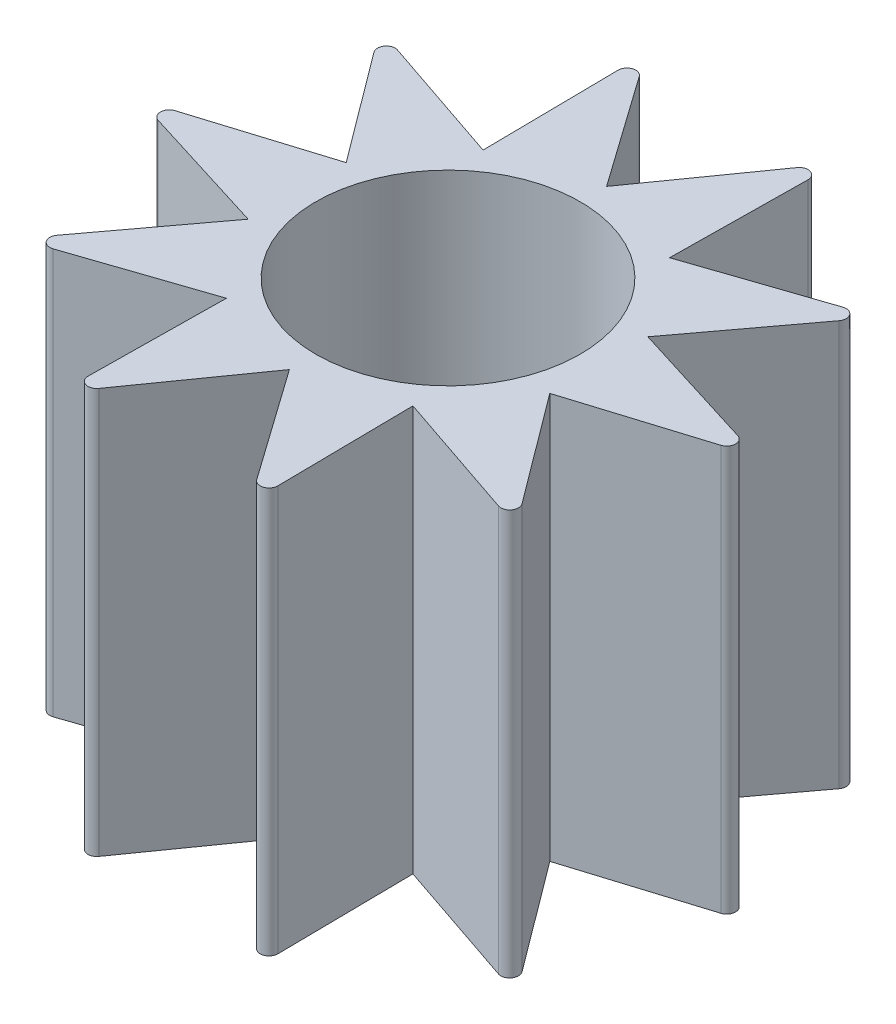
ISO-10303-21;
HEADER;
FILE_DESCRIPTION(('STEP AP214'),'2;1');
FILE_NAME('part.step','',(''),(''),'','','');
FILE_SCHEMA(('AUTOMOTIVE_DESIGN { 1 0 10303 214 1 1 1 1 }'));
ENDSEC;
DATA;
#1=APPLICATION_CONTEXT('core data for automotive mechanical design processes');
#2=APPLICATION_PROTOCOL_DEFINITION('international standard','automotive_design',2000,#1);
#3=PRODUCT_CONTEXT('',#1,'mechanical');
#4=PRODUCT('Part','Part','',(#3));
#5=PRODUCT_RELATED_PRODUCT_CATEGORY('part','',(#4));
#6=PRODUCT_DEFINITION_FORMATION('','',#4);
#7=PRODUCT_DEFINITION_CONTEXT('part definition',#1,'design');
#8=PRODUCT_DEFINITION('design','',#6,#7);
#9=PRODUCT_DEFINITION_SHAPE('','',#8);
#10=(LENGTH_UNIT() NAMED_UNIT(*) SI_UNIT(.MILLI.,.METRE.));
#11=(NAMED_UNIT(*) PLANE_ANGLE_UNIT() SI_UNIT($,.RADIAN.));
#12=(NAMED_UNIT(*) SI_UNIT($,.STERADIAN.) SOLID_ANGLE_UNIT());
#13=UNCERTAINTY_MEASURE_WITH_UNIT(LENGTH_MEASURE(1.E-05),#10,'distance_accuracy_value','');
#14=(GEOMETRIC_REPRESENTATION_CONTEXT(3) GLOBAL_UNCERTAINTY_ASSIGNED_CONTEXT((#13)) GLOBAL_UNIT_ASSIGNED_CONTEXT((#10,
#11,#12)) REPRESENTATION_CONTEXT('',''));
#15=CARTESIAN_POINT('',(0.,0.,0.));
#16=DIRECTION('',(0.,0.,1.));
#17=DIRECTION('',(1.,0.,0.));
#18=AXIS2_PLACEMENT_3D('',#15,#16,#17);
#19=CARTESIAN_POINT('',(0.,0.,0.));
#20=DIRECTION('',(0.,1.,0.));
#21=DIRECTION('',(0.,0.,1.));
#22=AXIS2_PLACEMENT_3D('',#19,#20,#21);
#23=PLANE('',#22);
#24=DIRECTION('',(0.57756630851164,0.,0.816343775178226));
#25=VECTOR('',#24,1.);
#26=CARTESIAN_POINT('',(0.,0.,-0.900000000000001));
#27=LINE('',#26,#25);
#28=CARTESIAN_POINT('',(-0.447945460970009,0.,-1.53313507608251));
#29=VERTEX_POINT('',#28);
#30=CARTESIAN_POINT('',(0.,0.,-0.9));
#31=VERTEX_POINT('',#30);
#32=EDGE_CURVE('E55',#29,#31,#27,.T.);
#33=ORIENTED_EDGE('',*,*,#32,.T.);
#34=DIRECTION('',(0.577566308511659,0.,-0.816343775178213));
#35=VECTOR('',#34,1.);
#36=CARTESIAN_POINT('',(0.447945460970036,0.,-1.53313507608251));
#37=LINE('',#36,#35);
#38=CARTESIAN_POINT('',(0.447945460970035,0.,-1.53313507608251));
#39=VERTEX_POINT('',#38);
#40=EDGE_CURVE('E252',#31,#39,#37,.T.);
#41=ORIENTED_EDGE('',*,*,#40,.T.);
#42=CARTESIAN_POINT('',(0.488762649728943,0.,-1.50425676065692));
#43=DIRECTION('',(0.,1.,0.));
#44=DIRECTION('',(0.,0.,1.));
#45=AXIS2_PLACEMENT_3D('',#42,#43,#44);
#46=CIRCLE('',#45,0.0500000000000028);
#47=CARTESIAN_POINT('',(0.538758697015725,0.,-1.50362806701262));
#48=VERTEX_POINT('',#47);
#49=EDGE_CURVE('E449',#39,#48,#46,.F.);
#50=ORIENTED_EDGE('',*,*,#49,.T.);
#51=DIRECTION('',(-0.0125738728861833,0.,0.999920945735533));
#52=VECTOR('',#51,1.);
#53=CARTESIAN_POINT('',(0.529006727063229,0.,-0.728115294937453));
#54=LINE('',#53,#52);
#55=CARTESIAN_POINT('',(0.529006727063229,0.,-0.728115294937453));
#56=VERTEX_POINT('',#55);
#57=EDGE_CURVE('E447',#48,#56,#54,.T.);
#58=ORIENTED_EDGE('',*,*,#57,.T.);
#59=DIRECTION('',(0.947095790814852,0.,-0.320951029007217));
#60=VECTOR('',#59,1.);
#61=CARTESIAN_POINT('',(1.26354967797147,0.,-0.977036595433534));
#62=LINE('',#61,#60);
#63=CARTESIAN_POINT('',(1.26354967797147,0.,-0.977036595433534));
#64=VERTEX_POINT('',#63);
#65=EDGE_CURVE('E445',#56,#64,#62,.T.);
#66=ORIENTED_EDGE('',*,*,#65,.T.);
#67=CARTESIAN_POINT('',(1.27959722942183,0.,-0.929681805892792));
#68=DIRECTION('',(0.,1.,0.));
#69=DIRECTION('',(0.,0.,1.));
#70=AXIS2_PLACEMENT_3D('',#67,#68,#69);
#71=CIRCLE('',#70,0.0500000000000001);
#72=CARTESIAN_POINT('',(1.31967534447607,0.,-0.899786242782203));
#73=VERTEX_POINT('',#72);
#74=EDGE_CURVE('E443',#64,#73,#71,.F.);
#75=ORIENTED_EDGE('',*,*,#74,.T.);
#76=DIRECTION('',(-0.597911262211717,0.,0.801562301084821));
#77=VECTOR('',#76,1.);
#78=CARTESIAN_POINT('',(0.855950864665639,0.,-0.278115294937449));
#79=LINE('',#78,#77);
#80=CARTESIAN_POINT('',(0.855950864665639,0.,-0.278115294937449));
#81=VERTEX_POINT('',#80);
#82=EDGE_CURVE('E441',#73,#81,#79,.T.);
#83=ORIENTED_EDGE('',*,*,#82,.T.);
#84=DIRECTION('',(0.954866871628731,0.,0.297034101520284));
#85=VECTOR('',#84,1.);
#86=CARTESIAN_POINT('',(1.59652086446179,0.,-0.0477433435814318));
#87=LINE('',#86,#85);
#88=CARTESIAN_POINT('',(1.59652086446179,0.,-0.0477433435814318));
#89=VERTEX_POINT('',#88);
#90=EDGE_CURVE('E439',#81,#89,#87,.T.);
#91=ORIENTED_EDGE('',*,*,#90,.T.);
#92=CARTESIAN_POINT('',(1.58166915938578,0.,0.));
#93=DIRECTION('',(0.,1.,0.));
#94=DIRECTION('',(0.,0.,1.));
#95=AXIS2_PLACEMENT_3D('',#92,#93,#94);
#96=CIRCLE('',#95,0.05);
#97=CARTESIAN_POINT('',(1.59652086446179,0.,0.0477433435814413));
#98=VERTEX_POINT('',#97);
#99=EDGE_CURVE('E437',#89,#98,#96,.F.);
#100=ORIENTED_EDGE('',*,*,#99,.T.);
#101=DIRECTION('',(-0.954866871628732,0.,0.297034101520282));
#102=VECTOR('',#101,1.);
#103=CARTESIAN_POINT('',(0.855950864665637,0.,0.278115294937457));
#104=LINE('',#103,#102);
#105=CARTESIAN_POINT('',(0.855950864665637,0.,0.278115294937457));
#106=VERTEX_POINT('',#105);
#107=EDGE_CURVE('E435',#98,#106,#104,.T.);
#108=ORIENTED_EDGE('',*,*,#107,.T.);
#109=DIRECTION('',(0.597911262211716,0.,0.801562301084822));
#110=VECTOR('',#109,1.);
#111=CARTESIAN_POINT('',(1.31967534447607,0.,0.899786242782211));
#112=LINE('',#111,#110);
#113=CARTESIAN_POINT('',(1.31967534447607,0.,0.899786242782211));
#114=VERTEX_POINT('',#113);
#115=EDGE_CURVE('E433',#106,#114,#112,.T.);
#116=ORIENTED_EDGE('',*,*,#115,.T.);
#117=CARTESIAN_POINT('',(1.27959722942183,0.,0.929681805892799));
#118=DIRECTION('',(0.,1.,0.));
#119=DIRECTION('',(0.,0.,1.));
#120=AXIS2_PLACEMENT_3D('',#117,#118,#119);
#121=CIRCLE('',#120,0.0499999999999999);
#122=CARTESIAN_POINT('',(1.26354967797147,0.,0.977036595433539));
#123=VERTEX_POINT('',#122);
#124=EDGE_CURVE('E431',#114,#123,#121,.F.);
#125=ORIENTED_EDGE('',*,*,#124,.T.);
#126=DIRECTION('',(-0.947095790814852,0.,-0.320951029007218));
#127=VECTOR('',#126,1.);
#128=CARTESIAN_POINT('',(0.529006727063221,0.,0.728115294937457));
#129=LINE('',#128,#127);
#130=CARTESIAN_POINT('',(0.529006727063221,0.,0.728115294937457));
#131=VERTEX_POINT('',#130);
#132=EDGE_CURVE('E429',#123,#131,#129,.T.);
#133=ORIENTED_EDGE('',*,*,#132,.T.);
#134=DIRECTION('',(0.0125738728861741,0.,0.999920945735534));
#135=VECTOR('',#134,1.);
#136=CARTESIAN_POINT('',(0.538758697015713,0.,1.50362806701261));
#137=LINE('',#136,#135);
#138=CARTESIAN_POINT('',(0.538758697015713,0.,1.50362806701261));
#139=VERTEX_POINT('',#138);
#140=EDGE_CURVE('E427',#131,#139,#137,.T.);
#141=ORIENTED_EDGE('',*,*,#140,.T.);
#142=CARTESIAN_POINT('',(0.488762649728936,0.,1.50425676065692));
#143=DIRECTION('',(0.,1.,0.));
#144=DIRECTION('',(0.,0.,1.));
#145=AXIS2_PLACEMENT_3D('',#142,#143,#144);
#146=CIRCLE('',#145,0.05);
#147=CARTESIAN_POINT('',(0.447945460970024,0.,1.53313507608251));
#148=VERTEX_POINT('',#147);
#149=EDGE_CURVE('E425',#139,#148,#146,.F.);
#150=ORIENTED_EDGE('',*,*,#149,.T.);
#151=DIRECTION('',(-0.577566308511657,0.,-0.816343775178214));
#152=VECTOR('',#151,1.);
#153=CARTESIAN_POINT('',(0.,0.,0.900000000000001));
#154=LINE('',#153,#152);
#155=CARTESIAN_POINT('',(0.,0.,0.900000000000001));
#156=VERTEX_POINT('',#155);
#157=EDGE_CURVE('E423',#148,#156,#154,.T.);
#158=ORIENTED_EDGE('',*,*,#157,.T.);
#159=DIRECTION('',(-0.577566308511664,0.,0.816343775178209));
#160=VECTOR('',#159,1.);
#161=CARTESIAN_POINT('',(-0.44794546097004,0.,1.5331350760825));
#162=LINE('',#161,#160);
#163=CARTESIAN_POINT('',(-0.44794546097004,0.,1.5331350760825));
#164=VERTEX_POINT('',#163);
#165=EDGE_CURVE('E421',#156,#164,#162,.T.);
#166=ORIENTED_EDGE('',*,*,#165,.T.);
#167=CARTESIAN_POINT('',(-0.488762649728951,0.,1.50425676065692));
#168=DIRECTION('',(0.,1.,0.));
#169=DIRECTION('',(0.,0.,1.));
#170=AXIS2_PLACEMENT_3D('',#167,#168,#169);
#171=CIRCLE('',#170,0.0500000000000001);
#172=CARTESIAN_POINT('',(-0.538758697015727,0.,1.50362806701261));
#173=VERTEX_POINT('',#172);
#174=EDGE_CURVE('E419',#164,#173,#171,.F.);
#175=ORIENTED_EDGE('',*,*,#174,.T.);
#176=DIRECTION('',(0.0125738728861831,0.,-0.999920945735533));
#177=VECTOR('',#176,1.);
#178=CARTESIAN_POINT('',(-0.529006727063231,0.,0.728115294937449));
#179=LINE('',#178,#177);
#180=CARTESIAN_POINT('',(-0.529006727063231,0.,0.728115294937449));
#181=VERTEX_POINT('',#180);
#182=EDGE_CURVE('E417',#173,#181,#179,.T.);
#183=ORIENTED_EDGE('',*,*,#182,.T.);
#184=DIRECTION('',(-0.947095790814855,0.,0.320951029007209));
#185=VECTOR('',#184,1.);
#186=CARTESIAN_POINT('',(-1.26354967797147,0.,0.977036595433524));
#187=LINE('',#186,#185);
#188=CARTESIAN_POINT('',(-1.26354967797147,0.,0.977036595433524));
#189=VERTEX_POINT('',#188);
#190=EDGE_CURVE('E415',#181,#189,#187,.T.);
#191=ORIENTED_EDGE('',*,*,#190,.T.);
#192=CARTESIAN_POINT('',(-1.27959722942184,0.,0.929681805892782));
#193=DIRECTION('',(0.,1.,0.));
#194=DIRECTION('',(0.,0.,1.));
#195=AXIS2_PLACEMENT_3D('',#192,#193,#194);
#196=CIRCLE('',#195,0.05);
#197=CARTESIAN_POINT('',(-1.31967534447608,0.,0.899786242782196));
#198=VERTEX_POINT('',#197);
#199=EDGE_CURVE('E413',#189,#198,#196,.F.);
#200=ORIENTED_EDGE('',*,*,#199,.T.);
#201=DIRECTION('',(0.597911262211723,0.,-0.801562301084816));
#202=VECTOR('',#201,1.);
#203=CARTESIAN_POINT('',(-0.855950864665641,0.,0.278115294937444));
#204=LINE('',#203,#202);
#205=CARTESIAN_POINT('',(-0.855950864665641,0.,0.278115294937444));
#206=VERTEX_POINT('',#205);
#207=EDGE_CURVE('E411',#198,#206,#204,.T.);
#208=ORIENTED_EDGE('',*,*,#207,.T.);
#209=DIRECTION('',(-0.954866871628729,0.,-0.297034101520289));
#210=VECTOR('',#209,1.);
#211=CARTESIAN_POINT('',(-1.59652086446179,0.,0.0477433435814231));
#212=LINE('',#211,#210);
#213=CARTESIAN_POINT('',(-1.59652086446179,0.,0.0477433435814231));
#214=VERTEX_POINT('',#213);
#215=EDGE_CURVE('E409',#206,#214,#212,.T.);
#216=ORIENTED_EDGE('',*,*,#215,.T.);
#217=CARTESIAN_POINT('',(-1.58166915938577,0.,0.));
#218=DIRECTION('',(0.,1.,0.));
#219=DIRECTION('',(0.,0.,1.));
#220=AXIS2_PLACEMENT_3D('',#217,#218,#219);
#221=CIRCLE('',#220,0.05);
#222=CARTESIAN_POINT('',(-1.59652086446179,0.,-0.0477433435814509));
#223=VERTEX_POINT('',#222);
#224=EDGE_CURVE('E407',#214,#223,#221,.F.);
#225=ORIENTED_EDGE('',*,*,#224,.T.);
#226=DIRECTION('',(0.954866871628733,0.,-0.297034101520276));
#227=VECTOR('',#226,1.);
#228=CARTESIAN_POINT('',(-0.855950864665634,0.,-0.278115294937461));
#229=LINE('',#228,#227);
#230=CARTESIAN_POINT('',(-0.855950864665635,0.,-0.278115294937461));
#231=VERTEX_POINT('',#230);
#232=EDGE_CURVE('E405',#223,#231,#229,.T.);
#233=ORIENTED_EDGE('',*,*,#232,.T.);
#234=DIRECTION('',(-0.59791126221171,0.,-0.801562301084826));
#235=VECTOR('',#234,1.);
#236=CARTESIAN_POINT('',(-1.31967534447606,0.,-0.899786242782219));
#237=LINE('',#236,#235);
#238=CARTESIAN_POINT('',(-1.31967534447606,0.,-0.899786242782219));
#239=VERTEX_POINT('',#238);
#240=EDGE_CURVE('E403',#231,#239,#237,.T.);
#241=ORIENTED_EDGE('',*,*,#240,.T.);
#242=CARTESIAN_POINT('',(-1.27959722942182,0.,-0.929681805892806));
#243=DIRECTION('',(0.,1.,0.));
#244=DIRECTION('',(0.,0.,1.));
#245=AXIS2_PLACEMENT_3D('',#242,#243,#244);
#246=CIRCLE('',#245,0.0500000000000001);
#247=CARTESIAN_POINT('',(-1.26354967797145,0.,-0.977036595433549));
#248=VERTEX_POINT('',#247);
#249=EDGE_CURVE('E401',#239,#248,#246,.F.);
#250=ORIENTED_EDGE('',*,*,#249,.T.);
#251=DIRECTION('',(0.947095790814849,0.,0.320951029007225));
#252=VECTOR('',#251,1.);
#253=CARTESIAN_POINT('',(-0.529006727063215,0.,-0.72811529493746));
#254=LINE('',#253,#252);
#255=CARTESIAN_POINT('',(-0.529006727063215,0.,-0.72811529493746));
#256=VERTEX_POINT('',#255);
#257=EDGE_CURVE('E397',#248,#256,#254,.T.);
#258=ORIENTED_EDGE('',*,*,#257,.T.);
#259=DIRECTION('',(-0.0125738728861667,0.,-0.999920945735533));
#260=VECTOR('',#259,1.);
#261=CARTESIAN_POINT('',(-0.538758697015699,0.,-1.50362806701262));
#262=LINE('',#261,#260);
#263=CARTESIAN_POINT('',(-0.538758697015699,0.,-1.50362806701262));
#264=VERTEX_POINT('',#263);
#265=EDGE_CURVE('E395',#256,#264,#262,.T.);
#266=ORIENTED_EDGE('',*,*,#265,.T.);
#267=CARTESIAN_POINT('',(-0.48876264972892,0.,-1.50425676065693));
#268=DIRECTION('',(0.,1.,0.));
#269=DIRECTION('',(0.,0.,1.));
#270=AXIS2_PLACEMENT_3D('',#267,#268,#269);
#271=CIRCLE('',#270,0.05);
#272=EDGE_CURVE('E392',#264,#29,#271,.F.);
#273=ORIENTED_EDGE('',*,*,#272,.T.);
#274=EDGE_LOOP('',(#33,#41,#50,#58,#66,#75,#83,#91,#100,#108,#116,#125,#133,#141,#150,#158,#166,
#175,#183,#191,#200,#208,#216,#225,#233,#241,#250,#258,#266,#273));
#275=FACE_BOUND('',#274,.T.);
#276=CARTESIAN_POINT('',(0.,0.,0.));
#277=DIRECTION('',(0.,1.,0.));
#278=DIRECTION('',(0.,0.,1.));
#279=AXIS2_PLACEMENT_3D('',#276,#277,#278);
#280=CIRCLE('',#279,0.75);
#281=CARTESIAN_POINT('',(0.,0.,0.750000000000001));
#282=VERTEX_POINT('',#281);
#283=EDGE_CURVE('E390',#282,#282,#280,.F.);
#284=ORIENTED_EDGE('',*,*,#283,.F.);
#285=EDGE_LOOP('',(#284));
#286=FACE_BOUND('',#285,.T.);
#287=ADVANCED_FACE('F33',(#275,#286),#23,.F.);
#288=CARTESIAN_POINT('',(0.,-0.001000000000001,0.));
#289=DIRECTION('',(0.,1.,0.));
#290=DIRECTION('',(0.,0.,1.));
#291=AXIS2_PLACEMENT_3D('',#288,#289,#290);
#292=CYLINDRICAL_SURFACE('',#291,0.75);
#293=CARTESIAN_POINT('',(0.,2.3,0.));
#294=DIRECTION('',(0.,1.,0.));
#295=DIRECTION('',(0.,0.,1.));
#296=AXIS2_PLACEMENT_3D('',#293,#294,#295);
#297=CIRCLE('',#296,0.75);
#298=CARTESIAN_POINT('',(0.,2.3,0.750000000000001));
#299=VERTEX_POINT('',#298);
#300=EDGE_CURVE('E11',#299,#299,#297,.T.);
#301=ORIENTED_EDGE('',*,*,#300,.T.);
#302=EDGE_LOOP('',(#301));
#303=FACE_BOUND('',#302,.T.);
#304=ORIENTED_EDGE('',*,*,#283,.T.);
#305=EDGE_LOOP('',(#304));
#306=FACE_BOUND('',#305,.T.);
#307=ADVANCED_FACE('F595',(#303,#306),#292,.F.);
#308=CARTESIAN_POINT('',(0.,-0.001000000000001,-0.900000000000001));
#309=DIRECTION('',(0.816343775178226,0.,-0.57756630851164));
#310=DIRECTION('',(-0.57756630851164,0.,-0.816343775178226));
#311=AXIS2_PLACEMENT_3D('',#308,#309,#310);
#312=PLANE('',#311);
#313=ORIENTED_EDGE('',*,*,#32,.F.);
#314=DIRECTION('',(0.,1.,0.));
#315=VECTOR('',#314,1.);
#316=CARTESIAN_POINT('',(-0.447945460970009,-0.001000000000001,-1.53313507608251));
#317=LINE('',#316,#315);
#318=CARTESIAN_POINT('',(-0.447945460970009,2.3,-1.53313507608251));
#319=VERTEX_POINT('',#318);
#320=EDGE_CURVE('E230',#29,#319,#317,.T.);
#321=ORIENTED_EDGE('',*,*,#320,.T.);
#322=DIRECTION('',(-0.57756630851164,0.,-0.816343775178226));
#323=VECTOR('',#322,1.);
#324=CARTESIAN_POINT('',(0.,2.3,-0.900000000000001));
#325=LINE('',#324,#323);
#326=CARTESIAN_POINT('',(0.,2.3,-0.900000000000001));
#327=VERTEX_POINT('',#326);
#328=EDGE_CURVE('E235',#327,#319,#325,.T.);
#329=ORIENTED_EDGE('',*,*,#328,.F.);
#330=DIRECTION('',(0.,1.,0.));
#331=VECTOR('',#330,1.);
#332=CARTESIAN_POINT('',(0.,-0.001000000000001,-0.900000000000001));
#333=LINE('',#332,#331);
#334=EDGE_CURVE('E40',#31,#327,#333,.T.);
#335=ORIENTED_EDGE('',*,*,#334,.F.);
#336=EDGE_LOOP('',(#313,#321,#329,#335));
#337=FACE_BOUND('',#336,.T.);
#338=ADVANCED_FACE('F232',(#337),#312,.T.);
#339=CARTESIAN_POINT('',(0.447945460970036,-0.001000000000001,-1.53313507608251));
#340=DIRECTION('',(-0.816343775178213,0.,-0.577566308511659));
#341=DIRECTION('',(-0.577566308511659,0.,0.816343775178213));
#342=AXIS2_PLACEMENT_3D('',#339,#340,#341);
#343=PLANE('',#342);
#344=ORIENTED_EDGE('',*,*,#40,.F.);
#345=ORIENTED_EDGE('',*,*,#334,.T.);
#346=DIRECTION('',(-0.577566308511659,0.,0.816343775178213));
#347=VECTOR('',#346,1.);
#348=CARTESIAN_POINT('',(0.447945460970036,2.3,-1.53313507608251));
#349=LINE('',#348,#347);
#350=CARTESIAN_POINT('',(0.447945460970036,2.3,-1.53313507608251));
#351=VERTEX_POINT('',#350);
#352=EDGE_CURVE('E240',#351,#327,#349,.T.);
#353=ORIENTED_EDGE('',*,*,#352,.F.);
#354=DIRECTION('',(0.,1.,0.));
#355=VECTOR('',#354,1.);
#356=CARTESIAN_POINT('',(0.447945460970036,-0.001000000000001,-1.53313507608251));
#357=LINE('',#356,#355);
#358=EDGE_CURVE('E336',#39,#351,#357,.T.);
#359=ORIENTED_EDGE('',*,*,#358,.F.);
#360=EDGE_LOOP('',(#344,#345,#353,#359));
#361=FACE_BOUND('',#360,.T.);
#362=ADVANCED_FACE('F459',(#361),#343,.T.);
#363=CARTESIAN_POINT('',(0.488762649728943,-0.001000000000001,-1.50425676065692));
#364=DIRECTION('',(0.,1.,0.));
#365=DIRECTION('',(0.,0.,1.));
#366=AXIS2_PLACEMENT_3D('',#363,#364,#365);
#367=CYLINDRICAL_SURFACE('',#366,0.0500000000000028);
#368=ORIENTED_EDGE('',*,*,#49,.F.);
#369=ORIENTED_EDGE('',*,*,#358,.T.);
#370=CARTESIAN_POINT('',(0.488762649728943,2.3,-1.50425676065692));
#371=DIRECTION('',(0.,1.,0.));
#372=DIRECTION('',(0.,0.,1.));
#373=AXIS2_PLACEMENT_3D('',#370,#371,#372);
#374=CIRCLE('',#373,0.0500000000000028);
#375=CARTESIAN_POINT('',(0.538758697015723,2.3,-1.50362806701262));
#376=VERTEX_POINT('',#375);
#377=EDGE_CURVE('E332',#376,#351,#374,.T.);
#378=ORIENTED_EDGE('',*,*,#377,.F.);
#379=DIRECTION('',(0.,1.,0.));
#380=VECTOR('',#379,1.);
#381=CARTESIAN_POINT('',(0.538758697015723,-0.001000000000001,-1.50362806701262));
#382=LINE('',#381,#380);
#383=EDGE_CURVE('E338',#48,#376,#382,.T.);
#384=ORIENTED_EDGE('',*,*,#383,.F.);
#385=EDGE_LOOP('',(#368,#369,#378,#384));
#386=FACE_BOUND('',#385,.T.);
#387=ADVANCED_FACE('F457',(#386),#367,.T.);
#388=CARTESIAN_POINT('',(0.529006727063229,-0.001000000000001,-0.728115294937453));
#389=DIRECTION('',(0.999920945735533,0.,0.0125738728861833));
#390=DIRECTION('',(0.0125738728861833,0.,-0.999920945735533));
#391=AXIS2_PLACEMENT_3D('',#388,#389,#390);
#392=PLANE('',#391);
#393=ORIENTED_EDGE('',*,*,#57,.F.);
#394=ORIENTED_EDGE('',*,*,#383,.T.);
#395=DIRECTION('',(0.0125738728861833,0.,-0.999920945735533));
#396=VECTOR('',#395,1.);
#397=CARTESIAN_POINT('',(0.529006727063229,2.3,-0.728115294937453));
#398=LINE('',#397,#396);
#399=CARTESIAN_POINT('',(0.529006727063229,2.3,-0.728115294937453));
#400=VERTEX_POINT('',#399);
#401=EDGE_CURVE('E329',#400,#376,#398,.T.);
#402=ORIENTED_EDGE('',*,*,#401,.F.);
#403=DIRECTION('',(0.,1.,0.));
#404=VECTOR('',#403,1.);
#405=CARTESIAN_POINT('',(0.529006727063229,-0.001000000000001,-0.728115294937453));
#406=LINE('',#405,#404);
#407=EDGE_CURVE('E340',#56,#400,#406,.T.);
#408=ORIENTED_EDGE('',*,*,#407,.F.);
#409=EDGE_LOOP('',(#393,#394,#402,#408));
#410=FACE_BOUND('',#409,.T.);
#411=ADVANCED_FACE('F464',(#410),#392,.T.);
#412=CARTESIAN_POINT('',(1.26354967797147,-0.001000000000001,-0.977036595433534));
#413=DIRECTION('',(-0.320951029007217,0.,-0.947095790814852));
#414=DIRECTION('',(-0.947095790814852,0.,0.320951029007217));
#415=AXIS2_PLACEMENT_3D('',#412,#413,#414);
#416=PLANE('',#415);
#417=ORIENTED_EDGE('',*,*,#65,.F.);
#418=ORIENTED_EDGE('',*,*,#407,.T.);
#419=DIRECTION('',(-0.947095790814852,0.,0.320951029007217));
#420=VECTOR('',#419,1.);
#421=CARTESIAN_POINT('',(1.26354967797147,2.3,-0.977036595433534));
#422=LINE('',#421,#420);
#423=CARTESIAN_POINT('',(1.26354967797147,2.3,-0.977036595433534));
#424=VERTEX_POINT('',#423);
#425=EDGE_CURVE('E326',#424,#400,#422,.T.);
#426=ORIENTED_EDGE('',*,*,#425,.F.);
#427=DIRECTION('',(0.,1.,0.));
#428=VECTOR('',#427,1.);
#429=CARTESIAN_POINT('',(1.26354967797147,-0.001000000000001,-0.977036595433534));
#430=LINE('',#429,#428);
#431=EDGE_CURVE('E342',#64,#424,#430,.T.);
#432=ORIENTED_EDGE('',*,*,#431,.F.);
#433=EDGE_LOOP('',(#417,#418,#426,#432));
#434=FACE_BOUND('',#433,.T.);
#435=ADVANCED_FACE('F469',(#434),#416,.T.);
#436=CARTESIAN_POINT('',(1.27959722942183,-0.001000000000001,-0.929681805892792));
#437=DIRECTION('',(0.,1.,0.));
#438=DIRECTION('',(0.,0.,1.));
#439=AXIS2_PLACEMENT_3D('',#436,#437,#438);
#440=CYLINDRICAL_SURFACE('',#439,0.0500000000000001);
#441=ORIENTED_EDGE('',*,*,#74,.F.);
#442=ORIENTED_EDGE('',*,*,#431,.T.);
#443=CARTESIAN_POINT('',(1.27959722942183,2.3,-0.929681805892792));
#444=DIRECTION('',(0.,1.,0.));
#445=DIRECTION('',(0.,0.,1.));
#446=AXIS2_PLACEMENT_3D('',#443,#444,#445);
#447=CIRCLE('',#446,0.0500000000000001);
#448=CARTESIAN_POINT('',(1.31967534447607,2.3,-0.899786242782203));
#449=VERTEX_POINT('',#448);
#450=EDGE_CURVE('E323',#449,#424,#447,.T.);
#451=ORIENTED_EDGE('',*,*,#450,.F.);
#452=DIRECTION('',(0.,1.,0.));
#453=VECTOR('',#452,1.);
#454=CARTESIAN_POINT('',(1.31967534447607,-0.001000000000001,-0.899786242782203));
#455=LINE('',#454,#453);
#456=EDGE_CURVE('E344',#73,#449,#455,.T.);
#457=ORIENTED_EDGE('',*,*,#456,.F.);
#458=EDGE_LOOP('',(#441,#442,#451,#457));
#459=FACE_BOUND('',#458,.T.);
#460=ADVANCED_FACE('F472',(#459),#440,.T.);
#461=CARTESIAN_POINT('',(0.855950864665639,-0.001000000000001,-0.278115294937449));
#462=DIRECTION('',(0.801562301084821,0.,0.597911262211717));
#463=DIRECTION('',(0.597911262211717,0.,-0.801562301084821));
#464=AXIS2_PLACEMENT_3D('',#461,#462,#463);
#465=PLANE('',#464);
#466=ORIENTED_EDGE('',*,*,#82,.F.);
#467=ORIENTED_EDGE('',*,*,#456,.T.);
#468=DIRECTION('',(0.597911262211717,0.,-0.801562301084821));
#469=VECTOR('',#468,1.);
#470=CARTESIAN_POINT('',(0.855950864665639,2.3,-0.278115294937449));
#471=LINE('',#470,#469);
#472=CARTESIAN_POINT('',(0.855950864665639,2.3,-0.278115294937449));
#473=VERTEX_POINT('',#472);
#474=EDGE_CURVE('E320',#473,#449,#471,.T.);
#475=ORIENTED_EDGE('',*,*,#474,.F.);
#476=DIRECTION('',(0.,1.,0.));
#477=VECTOR('',#476,1.);
#478=CARTESIAN_POINT('',(0.855950864665639,-0.001000000000001,-0.278115294937449));
#479=LINE('',#478,#477);
#480=EDGE_CURVE('E346',#81,#473,#479,.T.);
#481=ORIENTED_EDGE('',*,*,#480,.F.);
#482=EDGE_LOOP('',(#466,#467,#475,#481));
#483=FACE_BOUND('',#482,.T.);
#484=ADVANCED_FACE('F478',(#483),#465,.T.);
#485=CARTESIAN_POINT('',(1.59652086446179,-0.001000000000001,-0.0477433435814318));
#486=DIRECTION('',(0.297034101520284,0.,-0.954866871628731));
#487=DIRECTION('',(-0.954866871628731,0.,-0.297034101520284));
#488=AXIS2_PLACEMENT_3D('',#485,#486,#487);
#489=PLANE('',#488);
#490=ORIENTED_EDGE('',*,*,#90,.F.);
#491=ORIENTED_EDGE('',*,*,#480,.T.);
#492=DIRECTION('',(-0.954866871628731,0.,-0.297034101520284));
#493=VECTOR('',#492,1.);
#494=CARTESIAN_POINT('',(1.59652086446179,2.3,-0.0477433435814318));
#495=LINE('',#494,#493);
#496=CARTESIAN_POINT('',(1.59652086446179,2.3,-0.0477433435814318));
#497=VERTEX_POINT('',#496);
#498=EDGE_CURVE('E317',#497,#473,#495,.T.);
#499=ORIENTED_EDGE('',*,*,#498,.F.);
#500=DIRECTION('',(0.,1.,0.));
#501=VECTOR('',#500,1.);
#502=CARTESIAN_POINT('',(1.59652086446179,-0.001000000000001,-0.0477433435814318));
#503=LINE('',#502,#501);
#504=EDGE_CURVE('E348',#89,#497,#503,.T.);
#505=ORIENTED_EDGE('',*,*,#504,.F.);
#506=EDGE_LOOP('',(#490,#491,#499,#505));
#507=FACE_BOUND('',#506,.T.);
#508=ADVANCED_FACE('F482',(#507),#489,.T.);
#509=CARTESIAN_POINT('',(1.58166915938578,-0.001000000000001,0.));
#510=DIRECTION('',(0.,1.,0.));
#511=DIRECTION('',(0.,0.,1.));
#512=AXIS2_PLACEMENT_3D('',#509,#510,#511);
#513=CYLINDRICAL_SURFACE('',#512,0.05);
#514=ORIENTED_EDGE('',*,*,#99,.F.);
#515=ORIENTED_EDGE('',*,*,#504,.T.);
#516=CARTESIAN_POINT('',(1.58166915938578,2.3,0.));
#517=DIRECTION('',(0.,1.,0.));
#518=DIRECTION('',(0.,0.,1.));
#519=AXIS2_PLACEMENT_3D('',#516,#517,#518);
#520=CIRCLE('',#519,0.05);
#521=CARTESIAN_POINT('',(1.59652086446179,2.3,0.0477433435814413));
#522=VERTEX_POINT('',#521);
#523=EDGE_CURVE('E314',#522,#497,#520,.T.);
#524=ORIENTED_EDGE('',*,*,#523,.F.);
#525=DIRECTION('',(0.,1.,0.));
#526=VECTOR('',#525,1.);
#527=CARTESIAN_POINT('',(1.59652086446179,-0.001000000000001,0.0477433435814413));
#528=LINE('',#527,#526);
#529=EDGE_CURVE('E350',#98,#522,#528,.T.);
#530=ORIENTED_EDGE('',*,*,#529,.F.);
#531=EDGE_LOOP('',(#514,#515,#524,#530));
#532=FACE_BOUND('',#531,.T.);
#533=ADVANCED_FACE('F488',(#532),#513,.T.);
#534=CARTESIAN_POINT('',(0.855950864665637,-0.001000000000001,0.278115294937457));
#535=DIRECTION('',(0.297034101520282,0.,0.954866871628731));
#536=DIRECTION('',(0.954866871628732,0.,-0.297034101520282));
#537=AXIS2_PLACEMENT_3D('',#534,#535,#536);
#538=PLANE('',#537);
#539=ORIENTED_EDGE('',*,*,#107,.F.);
#540=ORIENTED_EDGE('',*,*,#529,.T.);
#541=DIRECTION('',(0.954866871628731,0.,-0.297034101520282));
#542=VECTOR('',#541,1.);
#543=CARTESIAN_POINT('',(0.855950864665637,2.3,0.278115294937457));
#544=LINE('',#543,#542);
#545=CARTESIAN_POINT('',(0.855950864665637,2.3,0.278115294937457));
#546=VERTEX_POINT('',#545);
#547=EDGE_CURVE('E311',#546,#522,#544,.T.);
#548=ORIENTED_EDGE('',*,*,#547,.F.);
#549=DIRECTION('',(0.,1.,0.));
#550=VECTOR('',#549,1.);
#551=CARTESIAN_POINT('',(0.855950864665637,-0.001000000000001,0.278115294937457));
#552=LINE('',#551,#550);
#553=EDGE_CURVE('E352',#106,#546,#552,.T.);
#554=ORIENTED_EDGE('',*,*,#553,.F.);
#555=EDGE_LOOP('',(#539,#540,#548,#554));
#556=FACE_BOUND('',#555,.T.);
#557=ADVANCED_FACE('F492',(#556),#538,.T.);
#558=CARTESIAN_POINT('',(1.31967534447607,-0.001000000000001,0.899786242782211));
#559=DIRECTION('',(0.801562301084822,0.,-0.597911262211716));
#560=DIRECTION('',(-0.597911262211716,0.,-0.801562301084822));
#561=AXIS2_PLACEMENT_3D('',#558,#559,#560);
#562=PLANE('',#561);
#563=ORIENTED_EDGE('',*,*,#115,.F.);
#564=ORIENTED_EDGE('',*,*,#553,.T.);
#565=DIRECTION('',(-0.597911262211716,0.,-0.801562301084822));
#566=VECTOR('',#565,1.);
#567=CARTESIAN_POINT('',(1.31967534447607,2.3,0.899786242782211));
#568=LINE('',#567,#566);
#569=CARTESIAN_POINT('',(1.31967534447607,2.3,0.899786242782211));
#570=VERTEX_POINT('',#569);
#571=EDGE_CURVE('E308',#570,#546,#568,.T.);
#572=ORIENTED_EDGE('',*,*,#571,.F.);
#573=DIRECTION('',(0.,1.,0.));
#574=VECTOR('',#573,1.);
#575=CARTESIAN_POINT('',(1.31967534447607,-0.001000000000001,0.899786242782211));
#576=LINE('',#575,#574);
#577=EDGE_CURVE('E354',#114,#570,#576,.T.);
#578=ORIENTED_EDGE('',*,*,#577,.F.);
#579=EDGE_LOOP('',(#563,#564,#572,#578));
#580=FACE_BOUND('',#579,.T.);
#581=ADVANCED_FACE('F498',(#580),#562,.T.);
#582=CARTESIAN_POINT('',(1.27959722942183,-0.001000000000001,0.929681805892799));
#583=DIRECTION('',(0.,1.,0.));
#584=DIRECTION('',(0.,0.,1.));
#585=AXIS2_PLACEMENT_3D('',#582,#583,#584);
#586=CYLINDRICAL_SURFACE('',#585,0.0499999999999999);
#587=ORIENTED_EDGE('',*,*,#124,.F.);
#588=ORIENTED_EDGE('',*,*,#577,.T.);
#589=CARTESIAN_POINT('',(1.27959722942183,2.3,0.929681805892799));
#590=DIRECTION('',(0.,1.,0.));
#591=DIRECTION('',(0.,0.,1.));
#592=AXIS2_PLACEMENT_3D('',#589,#590,#591);
#593=CIRCLE('',#592,0.0499999999999999);
#594=CARTESIAN_POINT('',(1.26354967797147,2.3,0.977036595433539));
#595=VERTEX_POINT('',#594);
#596=EDGE_CURVE('E305',#595,#570,#593,.T.);
#597=ORIENTED_EDGE('',*,*,#596,.F.);
#598=DIRECTION('',(0.,1.,0.));
#599=VECTOR('',#598,1.);
#600=CARTESIAN_POINT('',(1.26354967797147,-0.001000000000001,0.977036595433539));
#601=LINE('',#600,#599);
#602=EDGE_CURVE('E356',#123,#595,#601,.T.);
#603=ORIENTED_EDGE('',*,*,#602,.F.);
#604=EDGE_LOOP('',(#587,#588,#597,#603));
#605=FACE_BOUND('',#604,.T.);
#606=ADVANCED_FACE('F502',(#605),#586,.T.);
#607=CARTESIAN_POINT('',(0.529006727063221,-0.001000000000001,0.728115294937457));
#608=DIRECTION('',(-0.320951029007218,0.,0.947095790814852));
#609=DIRECTION('',(0.947095790814852,0.,0.320951029007218));
#610=AXIS2_PLACEMENT_3D('',#607,#608,#609);
#611=PLANE('',#610);
#612=ORIENTED_EDGE('',*,*,#132,.F.);
#613=ORIENTED_EDGE('',*,*,#602,.T.);
#614=DIRECTION('',(0.947095790814852,0.,0.320951029007218));
#615=VECTOR('',#614,1.);
#616=CARTESIAN_POINT('',(0.529006727063221,2.3,0.728115294937457));
#617=LINE('',#616,#615);
#618=CARTESIAN_POINT('',(0.529006727063221,2.3,0.728115294937457));
#619=VERTEX_POINT('',#618);
#620=EDGE_CURVE('E302',#619,#595,#617,.T.);
#621=ORIENTED_EDGE('',*,*,#620,.F.);
#622=DIRECTION('',(0.,1.,0.));
#623=VECTOR('',#622,1.);
#624=CARTESIAN_POINT('',(0.529006727063221,-0.001000000000001,0.728115294937457));
#625=LINE('',#624,#623);
#626=EDGE_CURVE('E358',#131,#619,#625,.T.);
#627=ORIENTED_EDGE('',*,*,#626,.F.);
#628=EDGE_LOOP('',(#612,#613,#621,#627));
#629=FACE_BOUND('',#628,.T.);
#630=ADVANCED_FACE('F508',(#629),#611,.T.);
#631=CARTESIAN_POINT('',(0.538758697015713,-0.001000000000001,1.50362806701261));
#632=DIRECTION('',(0.999920945735533,0.,-0.0125738728861741));
#633=DIRECTION('',(-0.0125738728861741,0.,-0.999920945735534));
#634=AXIS2_PLACEMENT_3D('',#631,#632,#633);
#635=PLANE('',#634);
#636=ORIENTED_EDGE('',*,*,#140,.F.);
#637=ORIENTED_EDGE('',*,*,#626,.T.);
#638=DIRECTION('',(-0.0125738728861741,0.,-0.999920945735533));
#639=VECTOR('',#638,1.);
#640=CARTESIAN_POINT('',(0.538758697015713,2.3,1.50362806701261));
#641=LINE('',#640,#639);
#642=CARTESIAN_POINT('',(0.538758697015713,2.3,1.50362806701261));
#643=VERTEX_POINT('',#642);
#644=EDGE_CURVE('E299',#643,#619,#641,.T.);
#645=ORIENTED_EDGE('',*,*,#644,.F.);
#646=DIRECTION('',(0.,1.,0.));
#647=VECTOR('',#646,1.);
#648=CARTESIAN_POINT('',(0.538758697015713,-0.001000000000001,1.50362806701261));
#649=LINE('',#648,#647);
#650=EDGE_CURVE('E360',#139,#643,#649,.T.);
#651=ORIENTED_EDGE('',*,*,#650,.F.);
#652=EDGE_LOOP('',(#636,#637,#645,#651));
#653=FACE_BOUND('',#652,.T.);
#654=ADVANCED_FACE('F512',(#653),#635,.T.);
#655=CARTESIAN_POINT('',(0.488762649728936,-0.001000000000001,1.50425676065692));
#656=DIRECTION('',(0.,1.,0.));
#657=DIRECTION('',(0.,0.,1.));
#658=AXIS2_PLACEMENT_3D('',#655,#656,#657);
#659=CYLINDRICAL_SURFACE('',#658,0.05);
#660=ORIENTED_EDGE('',*,*,#149,.F.);
#661=ORIENTED_EDGE('',*,*,#650,.T.);
#662=CARTESIAN_POINT('',(0.488762649728936,2.3,1.50425676065692));
#663=DIRECTION('',(0.,1.,0.));
#664=DIRECTION('',(0.,0.,1.));
#665=AXIS2_PLACEMENT_3D('',#662,#663,#664);
#666=CIRCLE('',#665,0.05);
#667=CARTESIAN_POINT('',(0.447945460970024,2.3,1.53313507608251));
#668=VERTEX_POINT('',#667);
#669=EDGE_CURVE('E296',#668,#643,#666,.T.);
#670=ORIENTED_EDGE('',*,*,#669,.F.);
#671=DIRECTION('',(0.,1.,0.));
#672=VECTOR('',#671,1.);
#673=CARTESIAN_POINT('',(0.447945460970024,-0.001000000000001,1.53313507608251));
#674=LINE('',#673,#672);
#675=EDGE_CURVE('E362',#148,#668,#674,.T.);
#676=ORIENTED_EDGE('',*,*,#675,.F.);
#677=EDGE_LOOP('',(#660,#661,#670,#676));
#678=FACE_BOUND('',#677,.T.);
#679=ADVANCED_FACE('F518',(#678),#659,.T.);
#680=CARTESIAN_POINT('',(0.,-0.001000000000001,0.900000000000001));
#681=DIRECTION('',(-0.816343775178214,0.,0.577566308511657));
#682=DIRECTION('',(0.577566308511657,0.,0.816343775178214));
#683=AXIS2_PLACEMENT_3D('',#680,#681,#682);
#684=PLANE('',#683);
#685=ORIENTED_EDGE('',*,*,#157,.F.);
#686=ORIENTED_EDGE('',*,*,#675,.T.);
#687=DIRECTION('',(0.577566308511657,0.,0.816343775178214));
#688=VECTOR('',#687,1.);
#689=CARTESIAN_POINT('',(0.,2.3,0.900000000000001));
#690=LINE('',#689,#688);
#691=CARTESIAN_POINT('',(0.,2.3,0.900000000000001));
#692=VERTEX_POINT('',#691);
#693=EDGE_CURVE('E293',#692,#668,#690,.T.);
#694=ORIENTED_EDGE('',*,*,#693,.F.);
#695=DIRECTION('',(0.,1.,0.));
#696=VECTOR('',#695,1.);
#697=CARTESIAN_POINT('',(0.,-0.001000000000001,0.900000000000001));
#698=LINE('',#697,#696);
#699=EDGE_CURVE('E364',#156,#692,#698,.T.);
#700=ORIENTED_EDGE('',*,*,#699,.F.);
#701=EDGE_LOOP('',(#685,#686,#694,#700));
#702=FACE_BOUND('',#701,.T.);
#703=ADVANCED_FACE('F522',(#702),#684,.T.);
#704=CARTESIAN_POINT('',(-0.44794546097004,-0.001000000000001,1.5331350760825));
#705=DIRECTION('',(0.816343775178209,0.,0.577566308511664));
#706=DIRECTION('',(0.577566308511664,0.,-0.816343775178209));
#707=AXIS2_PLACEMENT_3D('',#704,#705,#706);
#708=PLANE('',#707);
#709=ORIENTED_EDGE('',*,*,#165,.F.);
#710=ORIENTED_EDGE('',*,*,#699,.T.);
#711=DIRECTION('',(0.577566308511664,0.,-0.816343775178209));
#712=VECTOR('',#711,1.);
#713=CARTESIAN_POINT('',(-0.44794546097004,2.3,1.5331350760825));
#714=LINE('',#713,#712);
#715=CARTESIAN_POINT('',(-0.44794546097004,2.3,1.5331350760825));
#716=VERTEX_POINT('',#715);
#717=EDGE_CURVE('E290',#716,#692,#714,.T.);
#718=ORIENTED_EDGE('',*,*,#717,.F.);
#719=DIRECTION('',(0.,1.,0.));
#720=VECTOR('',#719,1.);
#721=CARTESIAN_POINT('',(-0.44794546097004,-0.001000000000001,1.5331350760825));
#722=LINE('',#721,#720);
#723=EDGE_CURVE('E366',#164,#716,#722,.T.);
#724=ORIENTED_EDGE('',*,*,#723,.F.);
#725=EDGE_LOOP('',(#709,#710,#718,#724));
#726=FACE_BOUND('',#725,.T.);
#727=ADVANCED_FACE('F528',(#726),#708,.T.);
#728=CARTESIAN_POINT('',(-0.488762649728951,-0.001000000000001,1.50425676065692));
#729=DIRECTION('',(0.,1.,0.));
#730=DIRECTION('',(0.,0.,1.));
#731=AXIS2_PLACEMENT_3D('',#728,#729,#730);
#732=CYLINDRICAL_SURFACE('',#731,0.0500000000000001);
#733=ORIENTED_EDGE('',*,*,#174,.F.);
#734=ORIENTED_EDGE('',*,*,#723,.T.);
#735=CARTESIAN_POINT('',(-0.488762649728951,2.3,1.50425676065692));
#736=DIRECTION('',(0.,1.,0.));
#737=DIRECTION('',(0.,0.,1.));
#738=AXIS2_PLACEMENT_3D('',#735,#736,#737);
#739=CIRCLE('',#738,0.0500000000000001);
#740=CARTESIAN_POINT('',(-0.538758697015727,2.3,1.50362806701261));
#741=VERTEX_POINT('',#740);
#742=EDGE_CURVE('E287',#741,#716,#739,.T.);
#743=ORIENTED_EDGE('',*,*,#742,.F.);
#744=DIRECTION('',(0.,1.,0.));
#745=VECTOR('',#744,1.);
#746=CARTESIAN_POINT('',(-0.538758697015727,-0.001000000000001,1.50362806701261));
#747=LINE('',#746,#745);
#748=EDGE_CURVE('E368',#173,#741,#747,.T.);
#749=ORIENTED_EDGE('',*,*,#748,.F.);
#750=EDGE_LOOP('',(#733,#734,#743,#749));
#751=FACE_BOUND('',#750,.T.);
#752=ADVANCED_FACE('F532',(#751),#732,.T.);
#753=CARTESIAN_POINT('',(-0.529006727063231,-0.001000000000001,0.728115294937449));
#754=DIRECTION('',(-0.999920945735533,0.,-0.0125738728861831));
#755=DIRECTION('',(-0.0125738728861831,0.,0.999920945735533));
#756=AXIS2_PLACEMENT_3D('',#753,#754,#755);
#757=PLANE('',#756);
#758=ORIENTED_EDGE('',*,*,#182,.F.);
#759=ORIENTED_EDGE('',*,*,#748,.T.);
#760=DIRECTION('',(-0.0125738728861831,0.,0.999920945735533));
#761=VECTOR('',#760,1.);
#762=CARTESIAN_POINT('',(-0.529006727063231,2.3,0.728115294937449));
#763=LINE('',#762,#761);
#764=CARTESIAN_POINT('',(-0.529006727063231,2.3,0.728115294937449));
#765=VERTEX_POINT('',#764);
#766=EDGE_CURVE('E284',#765,#741,#763,.T.);
#767=ORIENTED_EDGE('',*,*,#766,.F.);
#768=DIRECTION('',(0.,1.,0.));
#769=VECTOR('',#768,1.);
#770=CARTESIAN_POINT('',(-0.529006727063231,-0.001000000000001,0.728115294937449));
#771=LINE('',#770,#769);
#772=EDGE_CURVE('E370',#181,#765,#771,.T.);
#773=ORIENTED_EDGE('',*,*,#772,.F.);
#774=EDGE_LOOP('',(#758,#759,#767,#773));
#775=FACE_BOUND('',#774,.T.);
#776=ADVANCED_FACE('F538',(#775),#757,.T.);
#777=CARTESIAN_POINT('',(-1.26354967797147,-0.001000000000001,0.977036595433524));
#778=DIRECTION('',(0.320951029007209,0.,0.947095790814855));
#779=DIRECTION('',(0.947095790814855,0.,-0.320951029007209));
#780=AXIS2_PLACEMENT_3D('',#777,#778,#779);
#781=PLANE('',#780);
#782=ORIENTED_EDGE('',*,*,#190,.F.);
#783=ORIENTED_EDGE('',*,*,#772,.T.);
#784=DIRECTION('',(0.947095790814854,0.,-0.320951029007209));
#785=VECTOR('',#784,1.);
#786=CARTESIAN_POINT('',(-1.26354967797147,2.3,0.977036595433524));
#787=LINE('',#786,#785);
#788=CARTESIAN_POINT('',(-1.26354967797147,2.3,0.977036595433524));
#789=VERTEX_POINT('',#788);
#790=EDGE_CURVE('E281',#789,#765,#787,.T.);
#791=ORIENTED_EDGE('',*,*,#790,.F.);
#792=DIRECTION('',(0.,1.,0.));
#793=VECTOR('',#792,1.);
#794=CARTESIAN_POINT('',(-1.26354967797147,-0.001000000000001,0.977036595433524));
#795=LINE('',#794,#793);
#796=EDGE_CURVE('E372',#189,#789,#795,.T.);
#797=ORIENTED_EDGE('',*,*,#796,.F.);
#798=EDGE_LOOP('',(#782,#783,#791,#797));
#799=FACE_BOUND('',#798,.T.);
#800=ADVANCED_FACE('F542',(#799),#781,.T.);
#801=CARTESIAN_POINT('',(-1.27959722942184,-0.001000000000001,0.929681805892782));
#802=DIRECTION('',(0.,1.,0.));
#803=DIRECTION('',(0.,0.,1.));
#804=AXIS2_PLACEMENT_3D('',#801,#802,#803);
#805=CYLINDRICAL_SURFACE('',#804,0.05);
#806=ORIENTED_EDGE('',*,*,#199,.F.);
#807=ORIENTED_EDGE('',*,*,#796,.T.);
#808=CARTESIAN_POINT('',(-1.27959722942184,2.3,0.929681805892782));
#809=DIRECTION('',(0.,1.,0.));
#810=DIRECTION('',(0.,0.,1.));
#811=AXIS2_PLACEMENT_3D('',#808,#809,#810);
#812=CIRCLE('',#811,0.05);
#813=CARTESIAN_POINT('',(-1.31967534447608,2.3,0.899786242782195));
#814=VERTEX_POINT('',#813);
#815=EDGE_CURVE('E278',#814,#789,#812,.T.);
#816=ORIENTED_EDGE('',*,*,#815,.F.);
#817=DIRECTION('',(0.,1.,0.));
#818=VECTOR('',#817,1.);
#819=CARTESIAN_POINT('',(-1.31967534447608,-0.001000000000001,0.899786242782195));
#820=LINE('',#819,#818);
#821=EDGE_CURVE('E374',#198,#814,#820,.T.);
#822=ORIENTED_EDGE('',*,*,#821,.F.);
#823=EDGE_LOOP('',(#806,#807,#816,#822));
#824=FACE_BOUND('',#823,.T.);
#825=ADVANCED_FACE('F548',(#824),#805,.T.);
#826=CARTESIAN_POINT('',(-0.855950864665641,-0.001000000000001,0.278115294937444));
#827=DIRECTION('',(-0.801562301084816,0.,-0.597911262211723));
#828=DIRECTION('',(-0.597911262211723,0.,0.801562301084816));
#829=AXIS2_PLACEMENT_3D('',#826,#827,#828);
#830=PLANE('',#829);
#831=ORIENTED_EDGE('',*,*,#207,.F.);
#832=ORIENTED_EDGE('',*,*,#821,.T.);
#833=DIRECTION('',(-0.597911262211723,0.,0.801562301084816));
#834=VECTOR('',#833,1.);
#835=CARTESIAN_POINT('',(-0.855950864665641,2.3,0.278115294937444));
#836=LINE('',#835,#834);
#837=CARTESIAN_POINT('',(-0.855950864665641,2.3,0.278115294937444));
#838=VERTEX_POINT('',#837);
#839=EDGE_CURVE('E275',#838,#814,#836,.T.);
#840=ORIENTED_EDGE('',*,*,#839,.F.);
#841=DIRECTION('',(0.,1.,0.));
#842=VECTOR('',#841,1.);
#843=CARTESIAN_POINT('',(-0.855950864665641,-0.001000000000001,0.278115294937444));
#844=LINE('',#843,#842);
#845=EDGE_CURVE('E376',#206,#838,#844,.T.);
#846=ORIENTED_EDGE('',*,*,#845,.F.);
#847=EDGE_LOOP('',(#831,#832,#840,#846));
#848=FACE_BOUND('',#847,.T.);
#849=ADVANCED_FACE('F552',(#848),#830,.T.);
#850=CARTESIAN_POINT('',(-1.59652086446179,-0.001000000000001,0.0477433435814231));
#851=DIRECTION('',(-0.297034101520289,0.,0.954866871628729));
#852=DIRECTION('',(0.954866871628729,0.,0.297034101520289));
#853=AXIS2_PLACEMENT_3D('',#850,#851,#852);
#854=PLANE('',#853);
#855=ORIENTED_EDGE('',*,*,#215,.F.);
#856=ORIENTED_EDGE('',*,*,#845,.T.);
#857=DIRECTION('',(0.954866871628729,0.,0.297034101520289));
#858=VECTOR('',#857,1.);
#859=CARTESIAN_POINT('',(-1.59652086446179,2.3,0.0477433435814231));
#860=LINE('',#859,#858);
#861=CARTESIAN_POINT('',(-1.59652086446179,2.3,0.0477433435814231));
#862=VERTEX_POINT('',#861);
#863=EDGE_CURVE('E272',#862,#838,#860,.T.);
#864=ORIENTED_EDGE('',*,*,#863,.F.);
#865=DIRECTION('',(0.,1.,0.));
#866=VECTOR('',#865,1.);
#867=CARTESIAN_POINT('',(-1.59652086446179,-0.001000000000001,0.0477433435814231));
#868=LINE('',#867,#866);
#869=EDGE_CURVE('E378',#214,#862,#868,.T.);
#870=ORIENTED_EDGE('',*,*,#869,.F.);
#871=EDGE_LOOP('',(#855,#856,#864,#870));
#872=FACE_BOUND('',#871,.T.);
#873=ADVANCED_FACE('F558',(#872),#854,.T.);
#874=CARTESIAN_POINT('',(-1.58166915938577,-0.001000000000001,0.));
#875=DIRECTION('',(0.,1.,0.));
#876=DIRECTION('',(0.,0.,1.));
#877=AXIS2_PLACEMENT_3D('',#874,#875,#876);
#878=CYLINDRICAL_SURFACE('',#877,0.05);
#879=ORIENTED_EDGE('',*,*,#224,.F.);
#880=ORIENTED_EDGE('',*,*,#869,.T.);
#881=CARTESIAN_POINT('',(-1.58166915938577,2.3,0.));
#882=DIRECTION('',(0.,1.,0.));
#883=DIRECTION('',(0.,0.,1.));
#884=AXIS2_PLACEMENT_3D('',#881,#882,#883);
#885=CIRCLE('',#884,0.05);
#886=CARTESIAN_POINT('',(-1.59652086446179,2.3,-0.0477433435814509));
#887=VERTEX_POINT('',#886);
#888=EDGE_CURVE('E269',#887,#862,#885,.T.);
#889=ORIENTED_EDGE('',*,*,#888,.F.);
#890=DIRECTION('',(0.,1.,0.));
#891=VECTOR('',#890,1.);
#892=CARTESIAN_POINT('',(-1.59652086446179,-0.001000000000001,-0.0477433435814509));
#893=LINE('',#892,#891);
#894=EDGE_CURVE('E380',#223,#887,#893,.T.);
#895=ORIENTED_EDGE('',*,*,#894,.F.);
#896=EDGE_LOOP('',(#879,#880,#889,#895));
#897=FACE_BOUND('',#896,.T.);
#898=ADVANCED_FACE('F562',(#897),#878,.T.);
#899=CARTESIAN_POINT('',(-0.855950864665634,-0.001000000000001,-0.278115294937461));
#900=DIRECTION('',(-0.297034101520276,0.,-0.954866871628733));
#901=DIRECTION('',(-0.954866871628733,0.,0.297034101520276));
#902=AXIS2_PLACEMENT_3D('',#899,#900,#901);
#903=PLANE('',#902);
#904=ORIENTED_EDGE('',*,*,#232,.F.);
#905=ORIENTED_EDGE('',*,*,#894,.T.);
#906=DIRECTION('',(-0.954866871628733,0.,0.297034101520276));
#907=VECTOR('',#906,1.);
#908=CARTESIAN_POINT('',(-0.855950864665634,2.3,-0.278115294937461));
#909=LINE('',#908,#907);
#910=CARTESIAN_POINT('',(-0.855950864665634,2.3,-0.278115294937461));
#911=VERTEX_POINT('',#910);
#912=EDGE_CURVE('E266',#911,#887,#909,.T.);
#913=ORIENTED_EDGE('',*,*,#912,.F.);
#914=DIRECTION('',(0.,1.,0.));
#915=VECTOR('',#914,1.);
#916=CARTESIAN_POINT('',(-0.855950864665634,-0.001000000000001,-0.278115294937461));
#917=LINE('',#916,#915);
#918=EDGE_CURVE('E382',#231,#911,#917,.T.);
#919=ORIENTED_EDGE('',*,*,#918,.F.);
#920=EDGE_LOOP('',(#904,#905,#913,#919));
#921=FACE_BOUND('',#920,.T.);
#922=ADVANCED_FACE('F568',(#921),#903,.T.);
#923=CARTESIAN_POINT('',(-1.31967534447606,-0.001000000000001,-0.899786242782219));
#924=DIRECTION('',(-0.801562301084826,0.,0.59791126221171));
#925=DIRECTION('',(0.59791126221171,0.,0.801562301084826));
#926=AXIS2_PLACEMENT_3D('',#923,#924,#925);
#927=PLANE('',#926);
#928=ORIENTED_EDGE('',*,*,#240,.F.);
#929=ORIENTED_EDGE('',*,*,#918,.T.);
#930=DIRECTION('',(0.59791126221171,0.,0.801562301084826));
#931=VECTOR('',#930,1.);
#932=CARTESIAN_POINT('',(-1.31967534447606,2.3,-0.899786242782219));
#933=LINE('',#932,#931);
#934=CARTESIAN_POINT('',(-1.31967534447606,2.3,-0.899786242782219));
#935=VERTEX_POINT('',#934);
#936=EDGE_CURVE('E263',#935,#911,#933,.T.);
#937=ORIENTED_EDGE('',*,*,#936,.F.);
#938=DIRECTION('',(0.,1.,0.));
#939=VECTOR('',#938,1.);
#940=CARTESIAN_POINT('',(-1.31967534447606,-0.001000000000001,-0.899786242782219));
#941=LINE('',#940,#939);
#942=EDGE_CURVE('E384',#239,#935,#941,.T.);
#943=ORIENTED_EDGE('',*,*,#942,.F.);
#944=EDGE_LOOP('',(#928,#929,#937,#943));
#945=FACE_BOUND('',#944,.T.);
#946=ADVANCED_FACE('F572',(#945),#927,.T.);
#947=CARTESIAN_POINT('',(-1.27959722942182,-0.001000000000001,-0.929681805892806));
#948=DIRECTION('',(0.,1.,0.));
#949=DIRECTION('',(0.,0.,1.));
#950=AXIS2_PLACEMENT_3D('',#947,#948,#949);
#951=CYLINDRICAL_SURFACE('',#950,0.0500000000000001);
#952=ORIENTED_EDGE('',*,*,#249,.F.);
#953=ORIENTED_EDGE('',*,*,#942,.T.);
#954=CARTESIAN_POINT('',(-1.27959722942182,2.3,-0.929681805892806));
#955=DIRECTION('',(0.,1.,0.));
#956=DIRECTION('',(0.,0.,1.));
#957=AXIS2_PLACEMENT_3D('',#954,#955,#956);
#958=CIRCLE('',#957,0.0500000000000001);
#959=CARTESIAN_POINT('',(-1.26354967797145,2.3,-0.977036595433549));
#960=VERTEX_POINT('',#959);
#961=EDGE_CURVE('E260',#960,#935,#958,.T.);
#962=ORIENTED_EDGE('',*,*,#961,.F.);
#963=DIRECTION('',(0.,1.,0.));
#964=VECTOR('',#963,1.);
#965=CARTESIAN_POINT('',(-1.26354967797145,-0.001000000000001,-0.977036595433549));
#966=LINE('',#965,#964);
#967=EDGE_CURVE('E386',#248,#960,#966,.T.);
#968=ORIENTED_EDGE('',*,*,#967,.F.);
#969=EDGE_LOOP('',(#952,#953,#962,#968));
#970=FACE_BOUND('',#969,.T.);
#971=ADVANCED_FACE('F578',(#970),#951,.T.);
#972=CARTESIAN_POINT('',(-0.529006727063215,-0.001000000000001,-0.72811529493746));
#973=DIRECTION('',(0.320951029007225,0.,-0.947095790814849));
#974=DIRECTION('',(-0.947095790814849,0.,-0.320951029007225));
#975=AXIS2_PLACEMENT_3D('',#972,#973,#974);
#976=PLANE('',#975);
#977=ORIENTED_EDGE('',*,*,#257,.F.);
#978=ORIENTED_EDGE('',*,*,#967,.T.);
#979=DIRECTION('',(-0.947095790814849,0.,-0.320951029007225));
#980=VECTOR('',#979,1.);
#981=CARTESIAN_POINT('',(-0.529006727063215,2.3,-0.72811529493746));
#982=LINE('',#981,#980);
#983=CARTESIAN_POINT('',(-0.529006727063215,2.3,-0.72811529493746));
#984=VERTEX_POINT('',#983);
#985=EDGE_CURVE('E257',#984,#960,#982,.T.);
#986=ORIENTED_EDGE('',*,*,#985,.F.);
#987=DIRECTION('',(0.,1.,0.));
#988=VECTOR('',#987,1.);
#989=CARTESIAN_POINT('',(-0.529006727063215,-0.001000000000001,-0.72811529493746));
#990=LINE('',#989,#988);
#991=EDGE_CURVE('E388',#256,#984,#990,.T.);
#992=ORIENTED_EDGE('',*,*,#991,.F.);
#993=EDGE_LOOP('',(#977,#978,#986,#992));
#994=FACE_BOUND('',#993,.T.);
#995=ADVANCED_FACE('F582',(#994),#976,.T.);
#996=CARTESIAN_POINT('',(-0.538758697015699,-0.001000000000001,-1.50362806701262));
#997=DIRECTION('',(-0.999920945735533,0.,0.0125738728861667));
#998=DIRECTION('',(0.0125738728861667,0.,0.999920945735533));
#999=AXIS2_PLACEMENT_3D('',#996,#997,#998);
#1000=PLANE('',#999);
#1001=ORIENTED_EDGE('',*,*,#265,.F.);
#1002=ORIENTED_EDGE('',*,*,#991,.T.);
#1003=DIRECTION('',(0.0125738728861667,0.,0.999920945735533));
#1004=VECTOR('',#1003,1.);
#1005=CARTESIAN_POINT('',(-0.538758697015699,2.3,-1.50362806701262));
#1006=LINE('',#1005,#1004);
#1007=CARTESIAN_POINT('',(-0.538758697015699,2.3,-1.50362806701262));
#1008=VERTEX_POINT('',#1007);
#1009=EDGE_CURVE('E47',#1008,#984,#1006,.T.);
#1010=ORIENTED_EDGE('',*,*,#1009,.F.);
#1011=DIRECTION('',(0.,1.,0.));
#1012=VECTOR('',#1011,1.);
#1013=CARTESIAN_POINT('',(-0.538758697015699,-0.001000000000001,-1.50362806701262));
#1014=LINE('',#1013,#1012);
#1015=EDGE_CURVE('E239',#264,#1008,#1014,.T.);
#1016=ORIENTED_EDGE('',*,*,#1015,.F.);
#1017=EDGE_LOOP('',(#1001,#1002,#1010,#1016));
#1018=FACE_BOUND('',#1017,.T.);
#1019=ADVANCED_FACE('F585',(#1018),#1000,.T.);
#1020=CARTESIAN_POINT('',(-0.48876264972892,-0.001000000000001,-1.50425676065693));
#1021=DIRECTION('',(0.,1.,0.));
#1022=DIRECTION('',(0.,0.,1.));
#1023=AXIS2_PLACEMENT_3D('',#1020,#1021,#1022);
#1024=CYLINDRICAL_SURFACE('',#1023,0.05);
#1025=ORIENTED_EDGE('',*,*,#272,.F.);
#1026=ORIENTED_EDGE('',*,*,#1015,.T.);
#1027=CARTESIAN_POINT('',(-0.48876264972892,2.3,-1.50425676065693));
#1028=DIRECTION('',(0.,1.,0.));
#1029=DIRECTION('',(0.,0.,1.));
#1030=AXIS2_PLACEMENT_3D('',#1027,#1028,#1029);
#1031=CIRCLE('',#1030,0.05);
#1032=EDGE_CURVE('E243',#319,#1008,#1031,.T.);
#1033=ORIENTED_EDGE('',*,*,#1032,.F.);
#1034=ORIENTED_EDGE('',*,*,#320,.F.);
#1035=EDGE_LOOP('',(#1025,#1026,#1033,#1034));
#1036=FACE_BOUND('',#1035,.T.);
#1037=ADVANCED_FACE('F244',(#1036),#1024,.T.);
#1038=CARTESIAN_POINT('',(0.,2.3,0.));
#1039=DIRECTION('',(0.,1.,0.));
#1040=DIRECTION('',(0.,0.,1.));
#1041=AXIS2_PLACEMENT_3D('',#1038,#1039,#1040);
#1042=PLANE('',#1041);
#1043=ORIENTED_EDGE('',*,*,#352,.T.);
#1044=ORIENTED_EDGE('',*,*,#328,.T.);
#1045=ORIENTED_EDGE('',*,*,#1032,.T.);
#1046=ORIENTED_EDGE('',*,*,#1009,.T.);
#1047=ORIENTED_EDGE('',*,*,#985,.T.);
#1048=ORIENTED_EDGE('',*,*,#961,.T.);
#1049=ORIENTED_EDGE('',*,*,#936,.T.);
#1050=ORIENTED_EDGE('',*,*,#912,.T.);
#1051=ORIENTED_EDGE('',*,*,#888,.T.);
#1052=ORIENTED_EDGE('',*,*,#863,.T.);
#1053=ORIENTED_EDGE('',*,*,#839,.T.);
#1054=ORIENTED_EDGE('',*,*,#815,.T.);
#1055=ORIENTED_EDGE('',*,*,#790,.T.);
#1056=ORIENTED_EDGE('',*,*,#766,.T.);
#1057=ORIENTED_EDGE('',*,*,#742,.T.);
#1058=ORIENTED_EDGE('',*,*,#717,.T.);
#1059=ORIENTED_EDGE('',*,*,#693,.T.);
#1060=ORIENTED_EDGE('',*,*,#669,.T.);
#1061=ORIENTED_EDGE('',*,*,#644,.T.);
#1062=ORIENTED_EDGE('',*,*,#620,.T.);
#1063=ORIENTED_EDGE('',*,*,#596,.T.);
#1064=ORIENTED_EDGE('',*,*,#571,.T.);
#1065=ORIENTED_EDGE('',*,*,#547,.T.);
#1066=ORIENTED_EDGE('',*,*,#523,.T.);
#1067=ORIENTED_EDGE('',*,*,#498,.T.);
#1068=ORIENTED_EDGE('',*,*,#474,.T.);
#1069=ORIENTED_EDGE('',*,*,#450,.T.);
#1070=ORIENTED_EDGE('',*,*,#425,.T.);
#1071=ORIENTED_EDGE('',*,*,#401,.T.);
#1072=ORIENTED_EDGE('',*,*,#377,.T.);
#1073=EDGE_LOOP('',(#1043,#1044,#1045,#1046,#1047,#1048,#1049,#1050,#1051,#1052,#1053,#1054,
#1055,#1056,#1057,#1058,#1059,#1060,#1061,#1062,#1063,#1064,#1065,#1066,#1067,#1068,#1069,#1070,
#1071,#1072));
#1074=FACE_BOUND('',#1073,.T.);
#1075=ORIENTED_EDGE('',*,*,#300,.F.);
#1076=EDGE_LOOP('',(#1075));
#1077=FACE_BOUND('',#1076,.T.);
#1078=ADVANCED_FACE('F247',(#1074,#1077),#1042,.T.);
#1079=CLOSED_SHELL('',(#287,#307,#338,#362,#387,#411,#435,#460,#484,#508,#533,#557,#581,#606,
#630,#654,#679,#703,#727,#752,#776,#800,#825,#849,#873,#898,#922,#946,#971,#995,#1019,#1037,#1078));
#1080=MANIFOLD_SOLID_BREP('B2',#1079);
#1081=ADVANCED_BREP_SHAPE_REPRESENTATION('',(#18,#1080),#14);
#1082=SHAPE_DEFINITION_REPRESENTATION(#9,#1081);
ENDSEC;
END-ISO-10303-21;
